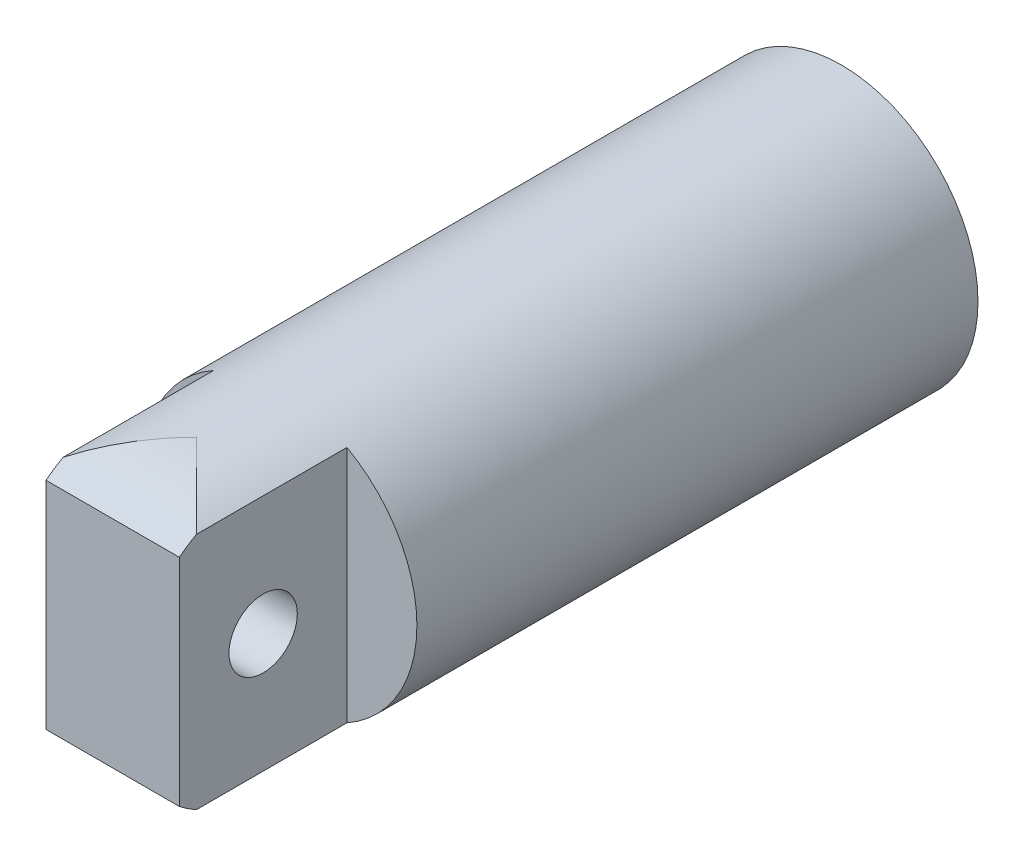
ISO-10303-21;
HEADER;
FILE_DESCRIPTION(('STEP AP214'),'2;1');
FILE_NAME('part.step','',(''),(''),'','','');
FILE_SCHEMA(('AUTOMOTIVE_DESIGN { 1 0 10303 214 1 1 1 1 }'));
ENDSEC;
DATA;
#1=APPLICATION_CONTEXT('core data for automotive mechanical design processes');
#2=APPLICATION_PROTOCOL_DEFINITION('international standard','automotive_design',2000,#1);
#3=PRODUCT_CONTEXT('',#1,'mechanical');
#4=PRODUCT('Part','Part','',(#3));
#5=PRODUCT_RELATED_PRODUCT_CATEGORY('part','',(#4));
#6=PRODUCT_DEFINITION_FORMATION('','',#4);
#7=PRODUCT_DEFINITION_CONTEXT('part definition',#1,'design');
#8=PRODUCT_DEFINITION('design','',#6,#7);
#9=PRODUCT_DEFINITION_SHAPE('','',#8);
#10=(LENGTH_UNIT() NAMED_UNIT(*) SI_UNIT(.MILLI.,.METRE.));
#11=(NAMED_UNIT(*) PLANE_ANGLE_UNIT() SI_UNIT($,.RADIAN.));
#12=(NAMED_UNIT(*) SI_UNIT($,.STERADIAN.) SOLID_ANGLE_UNIT());
#13=UNCERTAINTY_MEASURE_WITH_UNIT(LENGTH_MEASURE(1.E-05),#10,'distance_accuracy_value','');
#14=(GEOMETRIC_REPRESENTATION_CONTEXT(3) GLOBAL_UNCERTAINTY_ASSIGNED_CONTEXT((#13)) GLOBAL_UNIT_ASSIGNED_CONTEXT((#10,
#11,#12)) REPRESENTATION_CONTEXT('',''));
#15=CARTESIAN_POINT('',(0.,0.,0.));
#16=DIRECTION('',(0.,0.,1.));
#17=DIRECTION('',(1.,0.,0.));
#18=AXIS2_PLACEMENT_3D('',#15,#16,#17);
#19=CARTESIAN_POINT('',(-2.3241,4.7625,19.558));
#20=DIRECTION('',(-1.,0.,0.));
#21=DIRECTION('',(0.,0.,1.));
#22=AXIS2_PLACEMENT_3D('',#19,#20,#21);
#23=PLANE('',#22);
#24=CARTESIAN_POINT('',(-2.3241,0.,22.479));
#25=DIRECTION('',(-1.,0.,0.));
#26=DIRECTION('',(0.,0.,1.));
#27=AXIS2_PLACEMENT_3D('',#24,#25,#26);
#28=CIRCLE('',#27,1.190625);
#29=CARTESIAN_POINT('',(-2.3241,0.,23.669625));
#30=VERTEX_POINT('',#29);
#31=EDGE_CURVE('E121',#30,#30,#28,.T.);
#32=ORIENTED_EDGE('',*,*,#31,.F.);
#33=EDGE_LOOP('',(#32));
#34=FACE_BOUND('',#33,.T.);
#35=CARTESIAN_POINT('',(-2.3241,0.,22.479));
#36=DIRECTION('',(1.,0.,0.));
#37=DIRECTION('',(0.,0.,-1.));
#38=AXIS2_PLACEMENT_3D('',#35,#36,#37);
#39=CIRCLE('',#38,4.7625);
#40=CARTESIAN_POINT('',(-2.3241,-3.76153761778345,25.4));
#41=VERTEX_POINT('',#40);
#42=CARTESIAN_POINT('',(-2.3241,-4.15691778124129,24.8031));
#43=VERTEX_POINT('',#42);
#44=EDGE_CURVE('E103',#41,#43,#39,.T.);
#45=ORIENTED_EDGE('',*,*,#44,.F.);
#46=DIRECTION('',(0.,-1.,0.));
#47=VECTOR('',#46,1.);
#48=CARTESIAN_POINT('',(-2.3241,0.,25.4));
#49=LINE('',#48,#47);
#50=CARTESIAN_POINT('',(-2.3241,3.76153761778345,25.4));
#51=VERTEX_POINT('',#50);
#52=EDGE_CURVE('E144',#51,#41,#49,.T.);
#53=ORIENTED_EDGE('',*,*,#52,.F.);
#54=CARTESIAN_POINT('',(-2.3241,4.15691778124129,24.8031));
#55=VERTEX_POINT('',#54);
#56=EDGE_CURVE('E106',#55,#51,#39,.T.);
#57=ORIENTED_EDGE('',*,*,#56,.F.);
#58=DIRECTION('',(0.,0.,-1.));
#59=VECTOR('',#58,1.);
#60=CARTESIAN_POINT('',(-2.3241,4.15691778124129,25.4));
#61=LINE('',#60,#59);
#62=CARTESIAN_POINT('',(-2.3241,4.15691778124129,19.558));
#63=VERTEX_POINT('',#62);
#64=EDGE_CURVE('E134',#55,#63,#61,.T.);
#65=ORIENTED_EDGE('',*,*,#64,.T.);
#66=DIRECTION('',(0.,-1.,0.));
#67=VECTOR('',#66,1.);
#68=CARTESIAN_POINT('',(-2.3241,4.7625,19.558));
#69=LINE('',#68,#67);
#70=CARTESIAN_POINT('',(-2.3241,-4.15691778124129,19.558));
#71=VERTEX_POINT('',#70);
#72=EDGE_CURVE('E128',#63,#71,#69,.T.);
#73=ORIENTED_EDGE('',*,*,#72,.T.);
#74=DIRECTION('',(0.,0.,-1.));
#75=VECTOR('',#74,1.);
#76=CARTESIAN_POINT('',(-2.3241,-4.15691778124129,25.4));
#77=LINE('',#76,#75);
#78=EDGE_CURVE('E131',#71,#43,#77,.F.);
#79=ORIENTED_EDGE('',*,*,#78,.T.);
#80=EDGE_LOOP('',(#45,#53,#57,#65,#73,#79));
#81=FACE_BOUND('',#80,.T.);
#82=ADVANCED_FACE('F34',(#34,#81),#23,.T.);
#83=CARTESIAN_POINT('',(2.3241,4.7625,19.558));
#84=DIRECTION('',(1.,0.,0.));
#85=DIRECTION('',(0.,0.,-1.));
#86=AXIS2_PLACEMENT_3D('',#83,#84,#85);
#87=PLANE('',#86);
#88=CARTESIAN_POINT('',(2.3241,0.,22.479));
#89=DIRECTION('',(1.,0.,0.));
#90=DIRECTION('',(0.,0.,-1.));
#91=AXIS2_PLACEMENT_3D('',#88,#89,#90);
#92=CIRCLE('',#91,1.190625);
#93=CARTESIAN_POINT('',(2.3241,0.,21.288375));
#94=VERTEX_POINT('',#93);
#95=EDGE_CURVE('E124',#94,#94,#92,.T.);
#96=ORIENTED_EDGE('',*,*,#95,.F.);
#97=EDGE_LOOP('',(#96));
#98=FACE_BOUND('',#97,.T.);
#99=CARTESIAN_POINT('',(2.3241,0.,22.479));
#100=DIRECTION('',(1.,0.,0.));
#101=DIRECTION('',(0.,0.,-1.));
#102=AXIS2_PLACEMENT_3D('',#99,#100,#101);
#103=CIRCLE('',#102,4.7625);
#104=CARTESIAN_POINT('',(2.3241,-4.15691778124129,24.8031));
#105=VERTEX_POINT('',#104);
#106=CARTESIAN_POINT('',(2.3241,-3.76153761778345,25.4));
#107=VERTEX_POINT('',#106);
#108=EDGE_CURVE('E12',#105,#107,#103,.F.);
#109=ORIENTED_EDGE('',*,*,#108,.F.);
#110=DIRECTION('',(0.,0.,-1.));
#111=VECTOR('',#110,1.);
#112=CARTESIAN_POINT('',(2.3241,-4.15691778124129,25.4));
#113=LINE('',#112,#111);
#114=CARTESIAN_POINT('',(2.3241,-4.15691778124129,19.558));
#115=VERTEX_POINT('',#114);
#116=EDGE_CURVE('E139',#105,#115,#113,.T.);
#117=ORIENTED_EDGE('',*,*,#116,.T.);
#118=DIRECTION('',(0.,1.,0.));
#119=VECTOR('',#118,1.);
#120=CARTESIAN_POINT('',(2.3241,4.7625,19.558));
#121=LINE('',#120,#119);
#122=CARTESIAN_POINT('',(2.3241,4.15691778124129,19.558));
#123=VERTEX_POINT('',#122);
#124=EDGE_CURVE('E125',#115,#123,#121,.T.);
#125=ORIENTED_EDGE('',*,*,#124,.T.);
#126=DIRECTION('',(0.,0.,-1.));
#127=VECTOR('',#126,1.);
#128=CARTESIAN_POINT('',(2.3241,4.15691778124129,25.4));
#129=LINE('',#128,#127);
#130=CARTESIAN_POINT('',(2.3241,4.15691778124129,24.8031));
#131=VERTEX_POINT('',#130);
#132=EDGE_CURVE('E136',#123,#131,#129,.F.);
#133=ORIENTED_EDGE('',*,*,#132,.T.);
#134=CARTESIAN_POINT('',(2.3241,3.76153761778345,25.4));
#135=VERTEX_POINT('',#134);
#136=EDGE_CURVE('E38',#135,#131,#103,.F.);
#137=ORIENTED_EDGE('',*,*,#136,.F.);
#138=DIRECTION('',(0.,1.,0.));
#139=VECTOR('',#138,1.);
#140=CARTESIAN_POINT('',(2.3241,0.,25.4));
#141=LINE('',#140,#139);
#142=EDGE_CURVE('E147',#107,#135,#141,.T.);
#143=ORIENTED_EDGE('',*,*,#142,.F.);
#144=EDGE_LOOP('',(#109,#117,#125,#133,#137,#143));
#145=FACE_BOUND('',#144,.T.);
#146=ADVANCED_FACE('F158',(#98,#145),#87,.T.);
#147=CARTESIAN_POINT('',(0.,0.,25.4));
#148=DIRECTION('',(0.,0.,-1.));
#149=DIRECTION('',(-1.,0.,0.));
#150=AXIS2_PLACEMENT_3D('',#147,#148,#149);
#151=CYLINDRICAL_SURFACE('',#150,4.7625);
#152=CARTESIAN_POINT('',(0.,0.,0.));
#153=DIRECTION('',(0.,0.,1.));
#154=DIRECTION('',(1.,0.,0.));
#155=AXIS2_PLACEMENT_3D('',#152,#153,#154);
#156=CIRCLE('',#155,4.7625);
#157=CARTESIAN_POINT('',(4.7625,0.,0.));
#158=VERTEX_POINT('',#157);
#159=EDGE_CURVE('E141',#158,#158,#156,.T.);
#160=ORIENTED_EDGE('',*,*,#159,.T.);
#161=EDGE_LOOP('',(#160));
#162=FACE_BOUND('',#161,.T.);
#163=CARTESIAN_POINT('',(0.,0.,22.479));
#164=DIRECTION('',(0.707106781186547,0.,-0.707106781186548));
#165=DIRECTION('',(-0.707106781186547,0.,-0.707106781186548));
#166=AXIS2_PLACEMENT_3D('',#163,#164,#165);
#167=ELLIPSE('',#166,6.73519209080187,4.7625);
#168=CARTESIAN_POINT('',(0.,-4.7625,22.479));
#169=VERTEX_POINT('',#168);
#170=EDGE_CURVE('E56',#105,#169,#167,.T.);
#171=ORIENTED_EDGE('',*,*,#170,.T.);
#172=CARTESIAN_POINT('',(0.,0.,22.479));
#173=DIRECTION('',(-0.707106781186547,0.,-0.707106781186548));
#174=DIRECTION('',(0.707106781186547,0.,-0.707106781186548));
#175=AXIS2_PLACEMENT_3D('',#172,#173,#174);
#176=ELLIPSE('',#175,6.73519209080187,4.7625);
#177=EDGE_CURVE('E119',#169,#43,#176,.T.);
#178=ORIENTED_EDGE('',*,*,#177,.T.);
#179=ORIENTED_EDGE('',*,*,#78,.F.);
#180=CARTESIAN_POINT('',(0.,0.,19.558));
#181=DIRECTION('',(0.,0.,1.));
#182=DIRECTION('',(1.,0.,0.));
#183=AXIS2_PLACEMENT_3D('',#180,#181,#182);
#184=CIRCLE('',#183,4.7625);
#185=EDGE_CURVE('E150',#63,#71,#184,.T.);
#186=ORIENTED_EDGE('',*,*,#185,.F.);
#187=ORIENTED_EDGE('',*,*,#64,.F.);
#188=CARTESIAN_POINT('',(0.,4.7625,22.479));
#189=VERTEX_POINT('',#188);
#190=EDGE_CURVE('E115',#55,#189,#176,.T.);
#191=ORIENTED_EDGE('',*,*,#190,.T.);
#192=EDGE_CURVE('E112',#189,#131,#167,.T.);
#193=ORIENTED_EDGE('',*,*,#192,.T.);
#194=ORIENTED_EDGE('',*,*,#132,.F.);
#195=EDGE_CURVE('E151',#115,#123,#184,.T.);
#196=ORIENTED_EDGE('',*,*,#195,.F.);
#197=ORIENTED_EDGE('',*,*,#116,.F.);
#198=EDGE_LOOP('',(#171,#178,#179,#186,#187,#191,#193,#194,#196,#197));
#199=FACE_BOUND('',#198,.T.);
#200=ADVANCED_FACE('F36',(#162,#199),#151,.T.);
#201=CARTESIAN_POINT('',(0.,0.,25.4));
#202=DIRECTION('',(0.,0.,1.));
#203=DIRECTION('',(1.,0.,0.));
#204=AXIS2_PLACEMENT_3D('',#201,#202,#203);
#205=PLANE('',#204);
#206=DIRECTION('',(-1.,0.,0.));
#207=VECTOR('',#206,1.);
#208=CARTESIAN_POINT('',(4.7625,3.76153761778345,25.4));
#209=LINE('',#208,#207);
#210=EDGE_CURVE('E49',#51,#135,#209,.F.);
#211=ORIENTED_EDGE('',*,*,#210,.F.);
#212=ORIENTED_EDGE('',*,*,#52,.T.);
#213=DIRECTION('',(-1.,0.,0.));
#214=VECTOR('',#213,1.);
#215=CARTESIAN_POINT('',(4.7625,-3.76153761778345,25.4));
#216=LINE('',#215,#214);
#217=EDGE_CURVE('E118',#107,#41,#216,.T.);
#218=ORIENTED_EDGE('',*,*,#217,.F.);
#219=ORIENTED_EDGE('',*,*,#142,.T.);
#220=EDGE_LOOP('',(#211,#212,#218,#219));
#221=FACE_BOUND('',#220,.T.);
#222=ADVANCED_FACE('F203',(#221),#205,.T.);
#223=CARTESIAN_POINT('',(0.,0.,0.));
#224=DIRECTION('',(0.,0.,1.));
#225=DIRECTION('',(1.,0.,0.));
#226=AXIS2_PLACEMENT_3D('',#223,#224,#225);
#227=PLANE('',#226);
#228=CARTESIAN_POINT('',(0.,0.,0.));
#229=DIRECTION('',(0.,0.,-1.));
#230=DIRECTION('',(-1.,0.,0.));
#231=AXIS2_PLACEMENT_3D('',#228,#229,#230);
#232=CIRCLE('',#231,1.89864999999999);
#233=CARTESIAN_POINT('',(-1.89864999999999,0.,0.));
#234=VERTEX_POINT('',#233);
#235=EDGE_CURVE('E104',#234,#234,#232,.T.);
#236=ORIENTED_EDGE('',*,*,#235,.F.);
#237=EDGE_LOOP('',(#236));
#238=FACE_BOUND('',#237,.T.);
#239=ORIENTED_EDGE('',*,*,#159,.F.);
#240=EDGE_LOOP('',(#239));
#241=FACE_BOUND('',#240,.T.);
#242=ADVANCED_FACE('F182',(#238,#241),#227,.F.);
#243=CARTESIAN_POINT('',(0.,0.,19.558));
#244=DIRECTION('',(0.,0.,1.));
#245=DIRECTION('',(1.,0.,0.));
#246=AXIS2_PLACEMENT_3D('',#243,#244,#245);
#247=PLANE('',#246);
#248=ORIENTED_EDGE('',*,*,#185,.T.);
#249=ORIENTED_EDGE('',*,*,#72,.F.);
#250=EDGE_LOOP('',(#248,#249));
#251=FACE_BOUND('',#250,.T.);
#252=ADVANCED_FACE('F175',(#251),#247,.T.);
#253=ORIENTED_EDGE('',*,*,#195,.T.);
#254=ORIENTED_EDGE('',*,*,#124,.F.);
#255=EDGE_LOOP('',(#253,#254));
#256=FACE_BOUND('',#255,.T.);
#257=ADVANCED_FACE('F173',(#256),#247,.T.);
#258=CARTESIAN_POINT('',(-2.3241,0.,22.479));
#259=DIRECTION('',(-1.,0.,0.));
#260=DIRECTION('',(0.,0.,1.));
#261=AXIS2_PLACEMENT_3D('',#258,#259,#260);
#262=CYLINDRICAL_SURFACE('',#261,1.190625);
#263=ORIENTED_EDGE('',*,*,#95,.T.);
#264=EDGE_LOOP('',(#263));
#265=FACE_BOUND('',#264,.T.);
#266=ORIENTED_EDGE('',*,*,#31,.T.);
#267=EDGE_LOOP('',(#266));
#268=FACE_BOUND('',#267,.T.);
#269=ADVANCED_FACE('F155',(#265,#268),#262,.F.);
#270=CARTESIAN_POINT('',(4.7625,0.,22.479));
#271=DIRECTION('',(-1.,0.,0.));
#272=DIRECTION('',(0.,0.,1.));
#273=AXIS2_PLACEMENT_3D('',#270,#271,#272);
#274=CYLINDRICAL_SURFACE('',#273,4.7625);
#275=ORIENTED_EDGE('',*,*,#56,.T.);
#276=ORIENTED_EDGE('',*,*,#210,.T.);
#277=ORIENTED_EDGE('',*,*,#136,.T.);
#278=ORIENTED_EDGE('',*,*,#192,.F.);
#279=ORIENTED_EDGE('',*,*,#190,.F.);
#280=EDGE_LOOP('',(#275,#276,#277,#278,#279));
#281=FACE_BOUND('',#280,.T.);
#282=ADVANCED_FACE('F171',(#281),#274,.T.);
#283=ORIENTED_EDGE('',*,*,#170,.F.);
#284=ORIENTED_EDGE('',*,*,#108,.T.);
#285=ORIENTED_EDGE('',*,*,#217,.T.);
#286=ORIENTED_EDGE('',*,*,#44,.T.);
#287=ORIENTED_EDGE('',*,*,#177,.F.);
#288=EDGE_LOOP('',(#283,#284,#285,#286,#287));
#289=FACE_BOUND('',#288,.T.);
#290=ADVANCED_FACE('F97',(#289),#274,.T.);
#291=CARTESIAN_POINT('',(0.,0.,15.875));
#292=DIRECTION('',(0.,0.,-1.));
#293=DIRECTION('',(-1.,0.,0.));
#294=AXIS2_PLACEMENT_3D('',#291,#292,#293);
#295=CONICAL_SURFACE('',#294,1.89865,1.02974425867665);
#296=CARTESIAN_POINT('',(0.,0.,17.0158240143167));
#297=VERTEX_POINT('',#296);
#298=VERTEX_LOOP('',#297);
#299=FACE_BOUND('',#298,.T.);
#300=CARTESIAN_POINT('',(0.,0.,15.875));
#301=DIRECTION('',(0.,0.,-1.));
#302=DIRECTION('',(-1.,0.,0.));
#303=AXIS2_PLACEMENT_3D('',#300,#301,#302);
#304=CIRCLE('',#303,1.89865);
#305=CARTESIAN_POINT('',(-1.89865,0.,15.875));
#306=VERTEX_POINT('',#305);
#307=EDGE_CURVE('E101',#306,#306,#304,.T.);
#308=ORIENTED_EDGE('',*,*,#307,.T.);
#309=EDGE_LOOP('',(#308));
#310=FACE_BOUND('',#309,.T.);
#311=ADVANCED_FACE('F93',(#299,#310),#295,.F.);
#312=CARTESIAN_POINT('',(0.,0.,0.));
#313=DIRECTION('',(0.,0.,-1.));
#314=DIRECTION('',(-1.,0.,0.));
#315=AXIS2_PLACEMENT_3D('',#312,#313,#314);
#316=CYLINDRICAL_SURFACE('',#315,1.89864999999999);
#317=ORIENTED_EDGE('',*,*,#307,.F.);
#318=EDGE_LOOP('',(#317));
#319=FACE_BOUND('',#318,.T.);
#320=ORIENTED_EDGE('',*,*,#235,.T.);
#321=EDGE_LOOP('',(#320));
#322=FACE_BOUND('',#321,.T.);
#323=ADVANCED_FACE('F96',(#319,#322),#316,.F.);
#324=CLOSED_SHELL('',(#82,#146,#200,#222,#242,#252,#257,#269,#282,#290,#311,#323));
#325=MANIFOLD_SOLID_BREP('B2',#324);
#326=ADVANCED_BREP_SHAPE_REPRESENTATION('',(#18,#325),#14);
#327=SHAPE_DEFINITION_REPRESENTATION(#9,#326);
ENDSEC;
END-ISO-10303-21;
